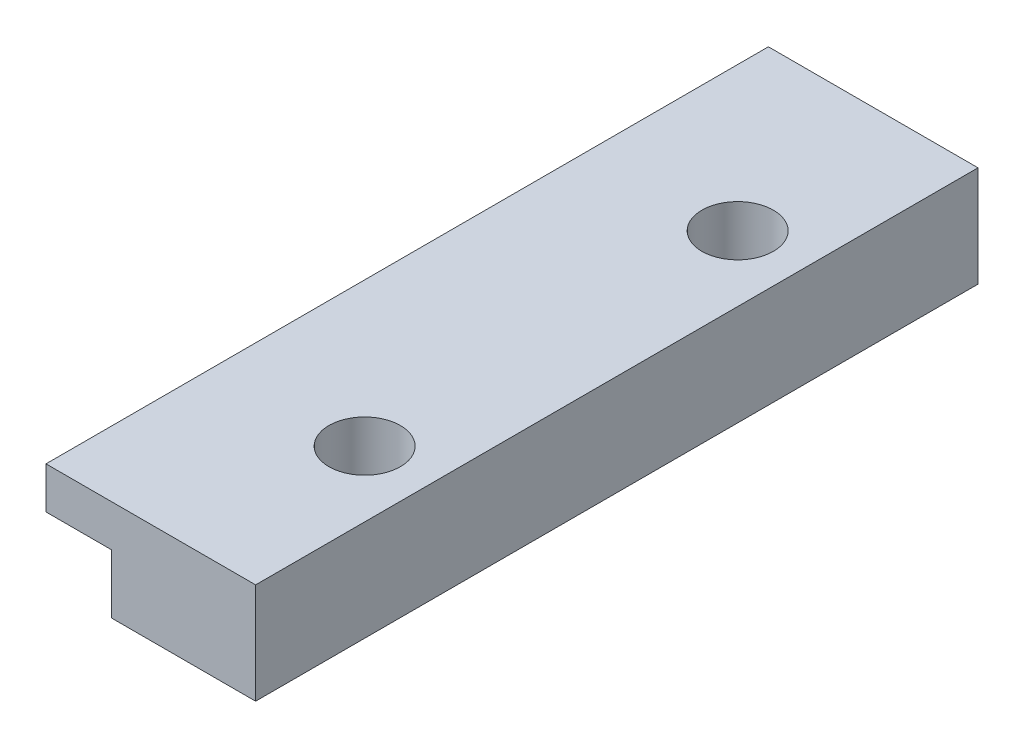
ISO-10303-21;
HEADER;
FILE_DESCRIPTION(('STEP AP214'),'2;1');
FILE_NAME('part.step','',(''),(''),'','','');
FILE_SCHEMA(('AUTOMOTIVE_DESIGN { 1 0 10303 214 1 1 1 1 }'));
ENDSEC;
DATA;
#1=APPLICATION_CONTEXT('core data for automotive mechanical design processes');
#2=APPLICATION_PROTOCOL_DEFINITION('international standard','automotive_design',2000,#1);
#3=PRODUCT_CONTEXT('',#1,'mechanical');
#4=PRODUCT('Part','Part','',(#3));
#5=PRODUCT_RELATED_PRODUCT_CATEGORY('part','',(#4));
#6=PRODUCT_DEFINITION_FORMATION('','',#4);
#7=PRODUCT_DEFINITION_CONTEXT('part definition',#1,'design');
#8=PRODUCT_DEFINITION('design','',#6,#7);
#9=PRODUCT_DEFINITION_SHAPE('','',#8);
#10=(LENGTH_UNIT() NAMED_UNIT(*) SI_UNIT(.MILLI.,.METRE.));
#11=(NAMED_UNIT(*) PLANE_ANGLE_UNIT() SI_UNIT($,.RADIAN.));
#12=(NAMED_UNIT(*) SI_UNIT($,.STERADIAN.) SOLID_ANGLE_UNIT());
#13=UNCERTAINTY_MEASURE_WITH_UNIT(LENGTH_MEASURE(1.E-05),#10,'distance_accuracy_value','');
#14=(GEOMETRIC_REPRESENTATION_CONTEXT(3) GLOBAL_UNCERTAINTY_ASSIGNED_CONTEXT((#13)) GLOBAL_UNIT_ASSIGNED_CONTEXT((#10,
#11,#12)) REPRESENTATION_CONTEXT('',''));
#15=CARTESIAN_POINT('',(0.,0.,0.));
#16=DIRECTION('',(0.,0.,1.));
#17=DIRECTION('',(1.,0.,0.));
#18=AXIS2_PLACEMENT_3D('',#15,#16,#17);
#19=CARTESIAN_POINT('',(0.000900720214878081,0.,0.));
#20=DIRECTION('',(-1.,0.,0.));
#21=DIRECTION('',(0.,-1.,0.));
#22=AXIS2_PLACEMENT_3D('',#19,#20,#21);
#23=PLANE('',#22);
#24=DIRECTION('',(0.,1.,0.));
#25=VECTOR('',#24,1.);
#26=CARTESIAN_POINT('',(0.000900720214893659,5.47421566723263,0.));
#27=LINE('',#26,#25);
#28=CARTESIAN_POINT('',(0.000900720214893633,5.71321716308603,0.));
#29=VERTEX_POINT('',#28);
#30=CARTESIAN_POINT('',(0.000900720214882184,0.,0.));
#31=VERTEX_POINT('',#30);
#32=EDGE_CURVE('E117',#29,#31,#27,.F.);
#33=ORIENTED_EDGE('',*,*,#32,.T.);
#34=DIRECTION('',(0.,0.,-1.));
#35=VECTOR('',#34,1.);
#36=CARTESIAN_POINT('',(0.000900720214878914,0.,0.));
#37=LINE('',#36,#35);
#38=CARTESIAN_POINT('',(0.000900720214882184,0.,69.85));
#39=VERTEX_POINT('',#38);
#40=EDGE_CURVE('E66',#39,#31,#37,.T.);
#41=ORIENTED_EDGE('',*,*,#40,.F.);
#42=DIRECTION('',(0.,1.,0.));
#43=VECTOR('',#42,1.);
#44=CARTESIAN_POINT('',(0.000900720214893659,5.47421566723263,69.85));
#45=LINE('',#44,#43);
#46=CARTESIAN_POINT('',(0.000900720214893633,5.71321716308603,69.85));
#47=VERTEX_POINT('',#46);
#48=EDGE_CURVE('E81',#47,#39,#45,.F.);
#49=ORIENTED_EDGE('',*,*,#48,.F.);
#50=DIRECTION('',(0.,0.,-1.));
#51=VECTOR('',#50,1.);
#52=CARTESIAN_POINT('',(0.000900720214893624,5.71321716308603,0.));
#53=LINE('',#52,#51);
#54=EDGE_CURVE('E71',#29,#47,#53,.F.);
#55=ORIENTED_EDGE('',*,*,#54,.F.);
#56=EDGE_LOOP('',(#33,#41,#49,#55));
#57=FACE_BOUND('',#56,.T.);
#58=ADVANCED_FACE('F16',(#57),#23,.T.);
#59=CARTESIAN_POINT('',(0.000900720214893624,5.71321716308603,0.));
#60=DIRECTION('',(0.,-1.,0.));
#61=DIRECTION('',(0.,0.,-1.));
#62=AXIS2_PLACEMENT_3D('',#59,#60,#61);
#63=PLANE('',#62);
#64=DIRECTION('',(1.,0.,0.));
#65=VECTOR('',#64,1.);
#66=CARTESIAN_POINT('',(4.41285561639397,5.71321716308603,0.));
#67=LINE('',#66,#65);
#68=CARTESIAN_POINT('',(-6.32369927978512,5.71321716308603,0.));
#69=VERTEX_POINT('',#68);
#70=EDGE_CURVE('E77',#69,#29,#67,.T.);
#71=ORIENTED_EDGE('',*,*,#70,.T.);
#72=ORIENTED_EDGE('',*,*,#54,.T.);
#73=DIRECTION('',(1.,0.,0.));
#74=VECTOR('',#73,1.);
#75=CARTESIAN_POINT('',(4.41285561639397,5.71321716308603,69.85));
#76=LINE('',#75,#74);
#77=CARTESIAN_POINT('',(-6.32369927978512,5.71321716308603,69.85));
#78=VERTEX_POINT('',#77);
#79=EDGE_CURVE('E75',#78,#47,#76,.T.);
#80=ORIENTED_EDGE('',*,*,#79,.F.);
#81=DIRECTION('',(0.,0.,1.));
#82=VECTOR('',#81,1.);
#83=CARTESIAN_POINT('',(-6.32369927978512,5.71321716308603,0.));
#84=LINE('',#83,#82);
#85=EDGE_CURVE('E104',#69,#78,#84,.T.);
#86=ORIENTED_EDGE('',*,*,#85,.F.);
#87=EDGE_LOOP('',(#71,#72,#80,#86));
#88=FACE_BOUND('',#87,.T.);
#89=ADVANCED_FACE('F72',(#88),#63,.T.);
#90=CARTESIAN_POINT('',(13.9455007202149,0.,0.));
#91=DIRECTION('',(0.,-1.,0.));
#92=DIRECTION('',(0.,0.,-1.));
#93=AXIS2_PLACEMENT_3D('',#90,#91,#92);
#94=PLANE('',#93);
#95=CARTESIAN_POINT('',(7.59550072021488,0.,52.959));
#96=DIRECTION('',(0.,1.,0.));
#97=DIRECTION('',(0.,0.,1.));
#98=AXIS2_PLACEMENT_3D('',#95,#96,#97);
#99=CIRCLE('',#98,3.4544);
#100=CARTESIAN_POINT('',(7.59550072021488,0.,56.4134));
#101=VERTEX_POINT('',#100);
#102=EDGE_CURVE('E95',#101,#101,#99,.T.);
#103=ORIENTED_EDGE('',*,*,#102,.T.);
#104=EDGE_LOOP('',(#103));
#105=FACE_BOUND('',#104,.T.);
#106=CARTESIAN_POINT('',(7.59550072021488,0.,16.891));
#107=DIRECTION('',(0.,1.,0.));
#108=DIRECTION('',(0.,0.,1.));
#109=AXIS2_PLACEMENT_3D('',#106,#107,#108);
#110=CIRCLE('',#109,3.4544);
#111=CARTESIAN_POINT('',(7.59550072021488,0.,20.3454));
#112=VERTEX_POINT('',#111);
#113=EDGE_CURVE('E19',#112,#112,#110,.T.);
#114=ORIENTED_EDGE('',*,*,#113,.T.);
#115=EDGE_LOOP('',(#114));
#116=FACE_BOUND('',#115,.T.);
#117=DIRECTION('',(1.,0.,0.));
#118=VECTOR('',#117,1.);
#119=CARTESIAN_POINT('',(4.41285561639397,0.,0.));
#120=LINE('',#119,#118);
#121=CARTESIAN_POINT('',(13.9455007202149,0.,0.));
#122=VERTEX_POINT('',#121);
#123=EDGE_CURVE('E115',#31,#122,#120,.T.);
#124=ORIENTED_EDGE('',*,*,#123,.T.);
#125=DIRECTION('',(0.,0.,-1.));
#126=VECTOR('',#125,1.);
#127=CARTESIAN_POINT('',(13.9455007202149,0.,0.));
#128=LINE('',#127,#126);
#129=CARTESIAN_POINT('',(13.9455007202149,0.,69.85));
#130=VERTEX_POINT('',#129);
#131=EDGE_CURVE('E120',#130,#122,#128,.T.);
#132=ORIENTED_EDGE('',*,*,#131,.F.);
#133=DIRECTION('',(1.,0.,0.));
#134=VECTOR('',#133,1.);
#135=CARTESIAN_POINT('',(4.41285561639397,0.,69.85));
#136=LINE('',#135,#134);
#137=EDGE_CURVE('E83',#39,#130,#136,.T.);
#138=ORIENTED_EDGE('',*,*,#137,.F.);
#139=ORIENTED_EDGE('',*,*,#40,.T.);
#140=EDGE_LOOP('',(#124,#132,#138,#139));
#141=FACE_BOUND('',#140,.T.);
#142=ADVANCED_FACE('F128',(#105,#116,#141),#94,.T.);
#143=CARTESIAN_POINT('',(4.41285561639397,5.47421566723263,69.85));
#144=DIRECTION('',(0.,0.,1.));
#145=DIRECTION('',(1.,0.,0.));
#146=AXIS2_PLACEMENT_3D('',#143,#144,#145);
#147=PLANE('',#146);
#148=ORIENTED_EDGE('',*,*,#48,.T.);
#149=ORIENTED_EDGE('',*,*,#137,.T.);
#150=DIRECTION('',(0.,1.,0.));
#151=VECTOR('',#150,1.);
#152=CARTESIAN_POINT('',(13.9455007202149,9.74452154210709,69.85));
#153=LINE('',#152,#151);
#154=CARTESIAN_POINT('',(13.9455007202149,9.74452154210709,69.85));
#155=VERTEX_POINT('',#154);
#156=EDGE_CURVE('E123',#155,#130,#153,.F.);
#157=ORIENTED_EDGE('',*,*,#156,.F.);
#158=DIRECTION('',(1.,0.,0.));
#159=VECTOR('',#158,1.);
#160=CARTESIAN_POINT('',(-6.32369927978512,9.74452154210709,69.85));
#161=LINE('',#160,#159);
#162=CARTESIAN_POINT('',(-6.32369927978512,9.74452154210709,69.85));
#163=VERTEX_POINT('',#162);
#164=EDGE_CURVE('E97',#163,#155,#161,.T.);
#165=ORIENTED_EDGE('',*,*,#164,.F.);
#166=DIRECTION('',(0.,1.,0.));
#167=VECTOR('',#166,1.);
#168=CARTESIAN_POINT('',(-6.32369927978512,5.71321716308603,69.85));
#169=LINE('',#168,#167);
#170=EDGE_CURVE('E87',#78,#163,#169,.T.);
#171=ORIENTED_EDGE('',*,*,#170,.F.);
#172=ORIENTED_EDGE('',*,*,#79,.T.);
#173=EDGE_LOOP('',(#148,#149,#157,#165,#171,#172));
#174=FACE_BOUND('',#173,.T.);
#175=ADVANCED_FACE('F85',(#174),#147,.T.);
#176=CARTESIAN_POINT('',(13.9455007202149,9.74452154210709,0.));
#177=DIRECTION('',(1.,0.,0.));
#178=DIRECTION('',(0.,0.,-1.));
#179=AXIS2_PLACEMENT_3D('',#176,#177,#178);
#180=PLANE('',#179);
#181=DIRECTION('',(0.,1.,0.));
#182=VECTOR('',#181,1.);
#183=CARTESIAN_POINT('',(13.9455007202149,5.47421566723263,0.));
#184=LINE('',#183,#182);
#185=CARTESIAN_POINT('',(13.9455007202149,9.74452154210709,0.));
#186=VERTEX_POINT('',#185);
#187=EDGE_CURVE('E113',#122,#186,#184,.T.);
#188=ORIENTED_EDGE('',*,*,#187,.T.);
#189=DIRECTION('',(0.,0.,1.));
#190=VECTOR('',#189,1.);
#191=CARTESIAN_POINT('',(13.9455007202149,9.74452154210709,0.));
#192=LINE('',#191,#190);
#193=EDGE_CURVE('E101',#155,#186,#192,.F.);
#194=ORIENTED_EDGE('',*,*,#193,.F.);
#195=ORIENTED_EDGE('',*,*,#156,.T.);
#196=ORIENTED_EDGE('',*,*,#131,.T.);
#197=EDGE_LOOP('',(#188,#194,#195,#196));
#198=FACE_BOUND('',#197,.T.);
#199=ADVANCED_FACE('F132',(#198),#180,.T.);
#200=CARTESIAN_POINT('',(4.41285561639397,5.47421566723263,0.));
#201=DIRECTION('',(0.,0.,1.));
#202=DIRECTION('',(1.,0.,0.));
#203=AXIS2_PLACEMENT_3D('',#200,#201,#202);
#204=PLANE('',#203);
#205=ORIENTED_EDGE('',*,*,#187,.F.);
#206=ORIENTED_EDGE('',*,*,#123,.F.);
#207=ORIENTED_EDGE('',*,*,#32,.F.);
#208=ORIENTED_EDGE('',*,*,#70,.F.);
#209=DIRECTION('',(0.,1.,0.));
#210=VECTOR('',#209,1.);
#211=CARTESIAN_POINT('',(-6.32369927978512,5.71321716308603,0.));
#212=LINE('',#211,#210);
#213=CARTESIAN_POINT('',(-6.32369927978512,9.74452154210709,0.));
#214=VERTEX_POINT('',#213);
#215=EDGE_CURVE('E34',#214,#69,#212,.F.);
#216=ORIENTED_EDGE('',*,*,#215,.F.);
#217=DIRECTION('',(1.,0.,0.));
#218=VECTOR('',#217,1.);
#219=CARTESIAN_POINT('',(-6.32369927978512,9.74452154210709,0.));
#220=LINE('',#219,#218);
#221=EDGE_CURVE('E136',#186,#214,#220,.F.);
#222=ORIENTED_EDGE('',*,*,#221,.F.);
#223=EDGE_LOOP('',(#205,#206,#207,#208,#216,#222));
#224=FACE_BOUND('',#223,.T.);
#225=ADVANCED_FACE('F142',(#224),#204,.F.);
#226=CARTESIAN_POINT('',(-6.32369927978512,5.71321716308603,0.));
#227=DIRECTION('',(-1.,0.,0.));
#228=DIRECTION('',(0.,0.,1.));
#229=AXIS2_PLACEMENT_3D('',#226,#227,#228);
#230=PLANE('',#229);
#231=ORIENTED_EDGE('',*,*,#215,.T.);
#232=ORIENTED_EDGE('',*,*,#85,.T.);
#233=ORIENTED_EDGE('',*,*,#170,.T.);
#234=DIRECTION('',(0.,0.,1.));
#235=VECTOR('',#234,1.);
#236=CARTESIAN_POINT('',(-6.32369927978512,9.74452154210709,0.));
#237=LINE('',#236,#235);
#238=EDGE_CURVE('E94',#214,#163,#237,.T.);
#239=ORIENTED_EDGE('',*,*,#238,.F.);
#240=EDGE_LOOP('',(#231,#232,#233,#239));
#241=FACE_BOUND('',#240,.T.);
#242=ADVANCED_FACE('F139',(#241),#230,.T.);
#243=CARTESIAN_POINT('',(7.59550072021488,-63.6368021630741,16.891));
#244=DIRECTION('',(0.,1.,0.));
#245=DIRECTION('',(0.,0.,1.));
#246=AXIS2_PLACEMENT_3D('',#243,#244,#245);
#247=CYLINDRICAL_SURFACE('',#246,3.4544);
#248=ORIENTED_EDGE('',*,*,#113,.F.);
#249=EDGE_LOOP('',(#248));
#250=FACE_BOUND('',#249,.T.);
#251=CARTESIAN_POINT('',(7.59550072021488,9.74452154210709,16.891));
#252=DIRECTION('',(0.,1.,0.));
#253=DIRECTION('',(0.,0.,1.));
#254=AXIS2_PLACEMENT_3D('',#251,#252,#253);
#255=CIRCLE('',#254,3.4544);
#256=CARTESIAN_POINT('',(7.59550072021488,9.74452154210709,20.3454));
#257=VERTEX_POINT('',#256);
#258=EDGE_CURVE('E25',#257,#257,#255,.F.);
#259=ORIENTED_EDGE('',*,*,#258,.F.);
#260=EDGE_LOOP('',(#259));
#261=FACE_BOUND('',#260,.T.);
#262=ADVANCED_FACE('F150',(#250,#261),#247,.F.);
#263=CARTESIAN_POINT('',(7.59550072021488,-63.6368021630741,52.959));
#264=DIRECTION('',(0.,1.,0.));
#265=DIRECTION('',(0.,0.,1.));
#266=AXIS2_PLACEMENT_3D('',#263,#264,#265);
#267=CYLINDRICAL_SURFACE('',#266,3.4544);
#268=ORIENTED_EDGE('',*,*,#102,.F.);
#269=EDGE_LOOP('',(#268));
#270=FACE_BOUND('',#269,.T.);
#271=CARTESIAN_POINT('',(7.59550072021488,9.74452154210709,52.959));
#272=DIRECTION('',(0.,1.,0.));
#273=DIRECTION('',(0.,0.,1.));
#274=AXIS2_PLACEMENT_3D('',#271,#272,#273);
#275=CIRCLE('',#274,3.4544);
#276=CARTESIAN_POINT('',(7.59550072021488,9.74452154210709,56.4134));
#277=VERTEX_POINT('',#276);
#278=EDGE_CURVE('E11',#277,#277,#275,.F.);
#279=ORIENTED_EDGE('',*,*,#278,.F.);
#280=EDGE_LOOP('',(#279));
#281=FACE_BOUND('',#280,.T.);
#282=ADVANCED_FACE('F154',(#270,#281),#267,.F.);
#283=CARTESIAN_POINT('',(-6.32369927978512,9.74452154210709,0.));
#284=DIRECTION('',(0.,1.,0.));
#285=DIRECTION('',(0.,0.,1.));
#286=AXIS2_PLACEMENT_3D('',#283,#284,#285);
#287=PLANE('',#286);
#288=ORIENTED_EDGE('',*,*,#278,.T.);
#289=EDGE_LOOP('',(#288));
#290=FACE_BOUND('',#289,.T.);
#291=ORIENTED_EDGE('',*,*,#258,.T.);
#292=EDGE_LOOP('',(#291));
#293=FACE_BOUND('',#292,.T.);
#294=ORIENTED_EDGE('',*,*,#221,.T.);
#295=ORIENTED_EDGE('',*,*,#238,.T.);
#296=ORIENTED_EDGE('',*,*,#164,.T.);
#297=ORIENTED_EDGE('',*,*,#193,.T.);
#298=EDGE_LOOP('',(#294,#295,#296,#297));
#299=FACE_BOUND('',#298,.T.);
#300=ADVANCED_FACE('F138',(#290,#293,#299),#287,.T.);
#301=CLOSED_SHELL('',(#58,#89,#142,#175,#199,#225,#242,#262,#282,#300));
#302=MANIFOLD_SOLID_BREP('B1',#301);
#303=ADVANCED_BREP_SHAPE_REPRESENTATION('',(#18,#302),#14);
#304=SHAPE_DEFINITION_REPRESENTATION(#9,#303);
ENDSEC;
END-ISO-10303-21;
